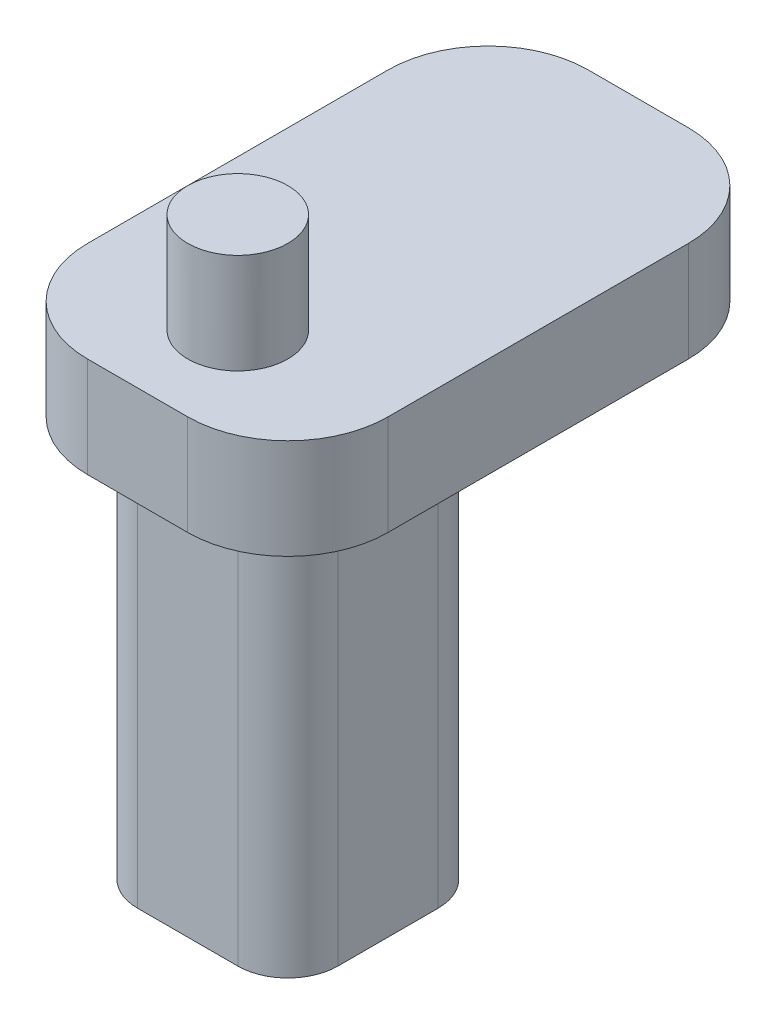
ISO-10303-21;
HEADER;
FILE_DESCRIPTION(('STEP AP214'),'2;1');
FILE_NAME('part.step','',(''),(''),'','','');
FILE_SCHEMA(('AUTOMOTIVE_DESIGN { 1 0 10303 214 1 1 1 1 }'));
ENDSEC;
DATA;
#1=APPLICATION_CONTEXT('core data for automotive mechanical design processes');
#2=APPLICATION_PROTOCOL_DEFINITION('international standard','automotive_design',2000,#1);
#3=PRODUCT_CONTEXT('',#1,'mechanical');
#4=PRODUCT('Part','Part','',(#3));
#5=PRODUCT_RELATED_PRODUCT_CATEGORY('part','',(#4));
#6=PRODUCT_DEFINITION_FORMATION('','',#4);
#7=PRODUCT_DEFINITION_CONTEXT('part definition',#1,'design');
#8=PRODUCT_DEFINITION('design','',#6,#7);
#9=PRODUCT_DEFINITION_SHAPE('','',#8);
#10=(LENGTH_UNIT() NAMED_UNIT(*) SI_UNIT(.MILLI.,.METRE.));
#11=(NAMED_UNIT(*) PLANE_ANGLE_UNIT() SI_UNIT($,.RADIAN.));
#12=(NAMED_UNIT(*) SI_UNIT($,.STERADIAN.) SOLID_ANGLE_UNIT());
#13=UNCERTAINTY_MEASURE_WITH_UNIT(LENGTH_MEASURE(1.E-05),#10,'distance_accuracy_value','');
#14=(GEOMETRIC_REPRESENTATION_CONTEXT(3) GLOBAL_UNCERTAINTY_ASSIGNED_CONTEXT((#13)) GLOBAL_UNIT_ASSIGNED_CONTEXT((#10,
#11,#12)) REPRESENTATION_CONTEXT('',''));
#15=CARTESIAN_POINT('',(0.,0.,0.));
#16=DIRECTION('',(0.,0.,1.));
#17=DIRECTION('',(1.,0.,0.));
#18=AXIS2_PLACEMENT_3D('',#15,#16,#17);
#19=CARTESIAN_POINT('',(0.,0.,0.));
#20=DIRECTION('',(0.,-1.,0.));
#21=DIRECTION('',(0.,0.,-1.));
#22=AXIS2_PLACEMENT_3D('',#19,#20,#21);
#23=PLANE('',#22);
#24=DIRECTION('',(1.,0.,0.));
#25=VECTOR('',#24,1.);
#26=CARTESIAN_POINT('',(-15.,0.,25.));
#27=LINE('',#26,#25);
#28=CARTESIAN_POINT('',(-4.99999999999999,0.,25.));
#29=VERTEX_POINT('',#28);
#30=CARTESIAN_POINT('',(5.,0.,25.));
#31=VERTEX_POINT('',#30);
#32=EDGE_CURVE('E189',#29,#31,#27,.T.);
#33=ORIENTED_EDGE('',*,*,#32,.F.);
#34=CARTESIAN_POINT('',(-4.99999999999999,0.,15.));
#35=DIRECTION('',(0.,-1.,0.));
#36=DIRECTION('',(0.,0.,-1.));
#37=AXIS2_PLACEMENT_3D('',#34,#35,#36);
#38=CIRCLE('',#37,10.);
#39=CARTESIAN_POINT('',(-15.,0.,15.));
#40=VERTEX_POINT('',#39);
#41=EDGE_CURVE('E236',#29,#40,#38,.T.);
#42=ORIENTED_EDGE('',*,*,#41,.T.);
#43=DIRECTION('',(0.,0.,1.));
#44=VECTOR('',#43,1.);
#45=CARTESIAN_POINT('',(-15.,0.,25.));
#46=LINE('',#45,#44);
#47=CARTESIAN_POINT('',(-15.,0.,-15.));
#48=VERTEX_POINT('',#47);
#49=EDGE_CURVE('E202',#48,#40,#46,.T.);
#50=ORIENTED_EDGE('',*,*,#49,.F.);
#51=CARTESIAN_POINT('',(-4.99999999999999,0.,-15.));
#52=DIRECTION('',(0.,-1.,0.));
#53=DIRECTION('',(0.,0.,-1.));
#54=AXIS2_PLACEMENT_3D('',#51,#52,#53);
#55=CIRCLE('',#54,10.);
#56=CARTESIAN_POINT('',(-4.99999999999999,0.,-25.));
#57=VERTEX_POINT('',#56);
#58=EDGE_CURVE('E215',#48,#57,#55,.T.);
#59=ORIENTED_EDGE('',*,*,#58,.T.);
#60=DIRECTION('',(-1.,0.,0.));
#61=VECTOR('',#60,1.);
#62=CARTESIAN_POINT('',(-15.,0.,-25.));
#63=LINE('',#62,#61);
#64=CARTESIAN_POINT('',(5.,0.,-25.));
#65=VERTEX_POINT('',#64);
#66=EDGE_CURVE('E199',#65,#57,#63,.T.);
#67=ORIENTED_EDGE('',*,*,#66,.F.);
#68=CARTESIAN_POINT('',(5.,0.,-15.));
#69=DIRECTION('',(0.,-1.,0.));
#70=DIRECTION('',(0.,0.,-1.));
#71=AXIS2_PLACEMENT_3D('',#68,#69,#70);
#72=CIRCLE('',#71,10.);
#73=CARTESIAN_POINT('',(15.,0.,-15.));
#74=VERTEX_POINT('',#73);
#75=EDGE_CURVE('E212',#65,#74,#72,.T.);
#76=ORIENTED_EDGE('',*,*,#75,.T.);
#77=DIRECTION('',(0.,0.,-1.));
#78=VECTOR('',#77,1.);
#79=CARTESIAN_POINT('',(15.,0.,25.));
#80=LINE('',#79,#78);
#81=CARTESIAN_POINT('',(15.,0.,15.));
#82=VERTEX_POINT('',#81);
#83=EDGE_CURVE('E180',#82,#74,#80,.T.);
#84=ORIENTED_EDGE('',*,*,#83,.F.);
#85=CARTESIAN_POINT('',(5.,0.,15.));
#86=DIRECTION('',(0.,-1.,0.));
#87=DIRECTION('',(0.,0.,-1.));
#88=AXIS2_PLACEMENT_3D('',#85,#86,#87);
#89=CIRCLE('',#88,10.);
#90=EDGE_CURVE('E234',#82,#31,#89,.T.);
#91=ORIENTED_EDGE('',*,*,#90,.T.);
#92=EDGE_LOOP('',(#33,#42,#50,#59,#67,#76,#84,#91));
#93=FACE_BOUND('',#92,.T.);
#94=DIRECTION('',(-1.,0.,0.));
#95=VECTOR('',#94,1.);
#96=CARTESIAN_POINT('',(-4.99999999999999,0.,20.));
#97=LINE('',#96,#95);
#98=CARTESIAN_POINT('',(5.,0.,20.));
#99=VERTEX_POINT('',#98);
#100=CARTESIAN_POINT('',(-4.99999999999999,0.,20.));
#101=VERTEX_POINT('',#100);
#102=EDGE_CURVE('E468',#99,#101,#97,.T.);
#103=ORIENTED_EDGE('',*,*,#102,.F.);
#104=CARTESIAN_POINT('',(5.,0.,15.));
#105=DIRECTION('',(0.,-1.,0.));
#106=DIRECTION('',(0.,0.,-1.));
#107=AXIS2_PLACEMENT_3D('',#104,#105,#106);
#108=CIRCLE('',#107,5.);
#109=CARTESIAN_POINT('',(10.,0.,15.));
#110=VERTEX_POINT('',#109);
#111=EDGE_CURVE('E175',#110,#99,#108,.T.);
#112=ORIENTED_EDGE('',*,*,#111,.F.);
#113=DIRECTION('',(0.,0.,1.));
#114=VECTOR('',#113,1.);
#115=CARTESIAN_POINT('',(10.,0.,15.));
#116=LINE('',#115,#114);
#117=CARTESIAN_POINT('',(10.,0.,5.00000000000007));
#118=VERTEX_POINT('',#117);
#119=EDGE_CURVE('E171',#118,#110,#116,.T.);
#120=ORIENTED_EDGE('',*,*,#119,.F.);
#121=CARTESIAN_POINT('',(5.,0.,5.));
#122=DIRECTION('',(0.,-1.,0.));
#123=DIRECTION('',(0.,0.,-1.));
#124=AXIS2_PLACEMENT_3D('',#121,#122,#123);
#125=CIRCLE('',#124,5.);
#126=CARTESIAN_POINT('',(4.99999999999997,0.,0.));
#127=VERTEX_POINT('',#126);
#128=EDGE_CURVE('E464',#127,#118,#125,.T.);
#129=ORIENTED_EDGE('',*,*,#128,.F.);
#130=DIRECTION('',(1.,0.,0.));
#131=VECTOR('',#130,1.);
#132=CARTESIAN_POINT('',(4.99999999999997,0.,0.));
#133=LINE('',#132,#131);
#134=CARTESIAN_POINT('',(-4.99999999999992,0.,0.));
#135=VERTEX_POINT('',#134);
#136=EDGE_CURVE('E480',#135,#127,#133,.T.);
#137=ORIENTED_EDGE('',*,*,#136,.F.);
#138=CARTESIAN_POINT('',(-4.99999999999999,0.,5.));
#139=DIRECTION('',(0.,-1.,0.));
#140=DIRECTION('',(0.,0.,-1.));
#141=AXIS2_PLACEMENT_3D('',#138,#139,#140);
#142=CIRCLE('',#141,5.);
#143=CARTESIAN_POINT('',(-9.99999999999999,0.,5.00000000000004));
#144=VERTEX_POINT('',#143);
#145=EDGE_CURVE('E478',#144,#135,#142,.T.);
#146=ORIENTED_EDGE('',*,*,#145,.F.);
#147=DIRECTION('',(0.,0.,-1.));
#148=VECTOR('',#147,1.);
#149=CARTESIAN_POINT('',(-9.99999999999999,0.,5.00000000000003));
#150=LINE('',#149,#148);
#151=CARTESIAN_POINT('',(-9.99999999999999,0.,15.));
#152=VERTEX_POINT('',#151);
#153=EDGE_CURVE('E476',#152,#144,#150,.T.);
#154=ORIENTED_EDGE('',*,*,#153,.F.);
#155=CARTESIAN_POINT('',(-4.99999999999999,0.,15.));
#156=DIRECTION('',(0.,-1.,0.));
#157=DIRECTION('',(0.,0.,-1.));
#158=AXIS2_PLACEMENT_3D('',#155,#156,#157);
#159=CIRCLE('',#158,5.);
#160=EDGE_CURVE('E470',#101,#152,#159,.T.);
#161=ORIENTED_EDGE('',*,*,#160,.F.);
#162=EDGE_LOOP('',(#103,#112,#120,#129,#137,#146,#154,#161));
#163=FACE_BOUND('',#162,.T.);
#164=ADVANCED_FACE('F38',(#93,#163),#23,.T.);
#165=CARTESIAN_POINT('',(15.,10.,25.));
#166=DIRECTION('',(-1.,0.,0.));
#167=DIRECTION('',(0.,0.,1.));
#168=AXIS2_PLACEMENT_3D('',#165,#166,#167);
#169=PLANE('',#168);
#170=DIRECTION('',(0.,0.,-1.));
#171=VECTOR('',#170,1.);
#172=CARTESIAN_POINT('',(15.,10.,25.));
#173=LINE('',#172,#171);
#174=CARTESIAN_POINT('',(15.,10.,15.));
#175=VERTEX_POINT('',#174);
#176=CARTESIAN_POINT('',(15.,10.,-15.));
#177=VERTEX_POINT('',#176);
#178=EDGE_CURVE('E186',#175,#177,#173,.T.);
#179=ORIENTED_EDGE('',*,*,#178,.F.);
#180=DIRECTION('',(0.,-1.,0.));
#181=VECTOR('',#180,1.);
#182=CARTESIAN_POINT('',(15.,10.,15.));
#183=LINE('',#182,#181);
#184=EDGE_CURVE('E11',#175,#82,#183,.T.);
#185=ORIENTED_EDGE('',*,*,#184,.T.);
#186=ORIENTED_EDGE('',*,*,#83,.T.);
#187=DIRECTION('',(0.,-1.,0.));
#188=VECTOR('',#187,1.);
#189=CARTESIAN_POINT('',(15.,10.,-15.));
#190=LINE('',#189,#188);
#191=EDGE_CURVE('E226',#74,#177,#190,.F.);
#192=ORIENTED_EDGE('',*,*,#191,.T.);
#193=EDGE_LOOP('',(#179,#185,#186,#192));
#194=FACE_BOUND('',#193,.T.);
#195=ADVANCED_FACE('F273',(#194),#169,.F.);
#196=CARTESIAN_POINT('',(-15.,10.,-25.));
#197=DIRECTION('',(0.,0.,1.));
#198=DIRECTION('',(1.,0.,0.));
#199=AXIS2_PLACEMENT_3D('',#196,#197,#198);
#200=PLANE('',#199);
#201=ORIENTED_EDGE('',*,*,#66,.T.);
#202=DIRECTION('',(0.,-1.,0.));
#203=VECTOR('',#202,1.);
#204=CARTESIAN_POINT('',(-4.99999999999999,10.,-25.));
#205=LINE('',#204,#203);
#206=CARTESIAN_POINT('',(-4.99999999999999,10.,-25.));
#207=VERTEX_POINT('',#206);
#208=EDGE_CURVE('E220',#57,#207,#205,.F.);
#209=ORIENTED_EDGE('',*,*,#208,.T.);
#210=DIRECTION('',(-1.,0.,0.));
#211=VECTOR('',#210,1.);
#212=CARTESIAN_POINT('',(-15.,10.,-25.));
#213=LINE('',#212,#211);
#214=CARTESIAN_POINT('',(5.,10.,-25.));
#215=VERTEX_POINT('',#214);
#216=EDGE_CURVE('E188',#215,#207,#213,.T.);
#217=ORIENTED_EDGE('',*,*,#216,.F.);
#218=DIRECTION('',(0.,-1.,0.));
#219=VECTOR('',#218,1.);
#220=CARTESIAN_POINT('',(5.,10.,-25.));
#221=LINE('',#220,#219);
#222=EDGE_CURVE('E217',#215,#65,#221,.T.);
#223=ORIENTED_EDGE('',*,*,#222,.T.);
#224=EDGE_LOOP('',(#201,#209,#217,#223));
#225=FACE_BOUND('',#224,.T.);
#226=ADVANCED_FACE('F264',(#225),#200,.F.);
#227=CARTESIAN_POINT('',(-15.,10.,25.));
#228=DIRECTION('',(1.,0.,0.));
#229=DIRECTION('',(0.,0.,-1.));
#230=AXIS2_PLACEMENT_3D('',#227,#228,#229);
#231=PLANE('',#230);
#232=ORIENTED_EDGE('',*,*,#49,.T.);
#233=DIRECTION('',(0.,-1.,0.));
#234=VECTOR('',#233,1.);
#235=CARTESIAN_POINT('',(-15.,10.,15.));
#236=LINE('',#235,#234);
#237=CARTESIAN_POINT('',(-15.,10.,15.));
#238=VERTEX_POINT('',#237);
#239=EDGE_CURVE('E238',#40,#238,#236,.F.);
#240=ORIENTED_EDGE('',*,*,#239,.T.);
#241=DIRECTION('',(0.,0.,1.));
#242=VECTOR('',#241,1.);
#243=CARTESIAN_POINT('',(-15.,10.,25.));
#244=LINE('',#243,#242);
#245=CARTESIAN_POINT('',(-15.,10.,-15.));
#246=VERTEX_POINT('',#245);
#247=EDGE_CURVE('E192',#246,#238,#244,.T.);
#248=ORIENTED_EDGE('',*,*,#247,.F.);
#249=DIRECTION('',(0.,-1.,0.));
#250=VECTOR('',#249,1.);
#251=CARTESIAN_POINT('',(-15.,10.,-15.));
#252=LINE('',#251,#250);
#253=EDGE_CURVE('E209',#246,#48,#252,.T.);
#254=ORIENTED_EDGE('',*,*,#253,.T.);
#255=EDGE_LOOP('',(#232,#240,#248,#254));
#256=FACE_BOUND('',#255,.T.);
#257=ADVANCED_FACE('F256',(#256),#231,.F.);
#258=CARTESIAN_POINT('',(-15.,10.,25.));
#259=DIRECTION('',(0.,0.,-1.));
#260=DIRECTION('',(-1.,0.,0.));
#261=AXIS2_PLACEMENT_3D('',#258,#259,#260);
#262=PLANE('',#261);
#263=DIRECTION('',(1.,0.,0.));
#264=VECTOR('',#263,1.);
#265=CARTESIAN_POINT('',(-15.,10.,25.));
#266=LINE('',#265,#264);
#267=CARTESIAN_POINT('',(-4.99999999999999,10.,25.));
#268=VERTEX_POINT('',#267);
#269=CARTESIAN_POINT('',(5.,10.,25.));
#270=VERTEX_POINT('',#269);
#271=EDGE_CURVE('E195',#268,#270,#266,.T.);
#272=ORIENTED_EDGE('',*,*,#271,.F.);
#273=DIRECTION('',(0.,-1.,0.));
#274=VECTOR('',#273,1.);
#275=CARTESIAN_POINT('',(-4.99999999999999,10.,25.));
#276=LINE('',#275,#274);
#277=EDGE_CURVE('E231',#268,#29,#276,.T.);
#278=ORIENTED_EDGE('',*,*,#277,.T.);
#279=ORIENTED_EDGE('',*,*,#32,.T.);
#280=DIRECTION('',(0.,-1.,0.));
#281=VECTOR('',#280,1.);
#282=CARTESIAN_POINT('',(5.,10.,25.));
#283=LINE('',#282,#281);
#284=EDGE_CURVE('E229',#31,#270,#283,.F.);
#285=ORIENTED_EDGE('',*,*,#284,.T.);
#286=EDGE_LOOP('',(#272,#278,#279,#285));
#287=FACE_BOUND('',#286,.T.);
#288=ADVANCED_FACE('F248',(#287),#262,.F.);
#289=CARTESIAN_POINT('',(0.,10.,0.));
#290=DIRECTION('',(0.,-1.,0.));
#291=DIRECTION('',(0.,0.,-1.));
#292=AXIS2_PLACEMENT_3D('',#289,#290,#291);
#293=PLANE('',#292);
#294=CARTESIAN_POINT('',(0.,10.,15.));
#295=DIRECTION('',(0.,-1.,0.));
#296=DIRECTION('',(0.,0.,-1.));
#297=AXIS2_PLACEMENT_3D('',#294,#295,#296);
#298=CIRCLE('',#297,5.);
#299=CARTESIAN_POINT('',(0.,10.,9.99999999999999));
#300=VERTEX_POINT('',#299);
#301=EDGE_CURVE('E197',#300,#300,#298,.F.);
#302=ORIENTED_EDGE('',*,*,#301,.F.);
#303=EDGE_LOOP('',(#302));
#304=FACE_BOUND('',#303,.T.);
#305=ORIENTED_EDGE('',*,*,#247,.T.);
#306=CARTESIAN_POINT('',(-4.99999999999999,10.,15.));
#307=DIRECTION('',(0.,-1.,0.));
#308=DIRECTION('',(0.,0.,-1.));
#309=AXIS2_PLACEMENT_3D('',#306,#307,#308);
#310=CIRCLE('',#309,10.);
#311=EDGE_CURVE('E46',#238,#268,#310,.F.);
#312=ORIENTED_EDGE('',*,*,#311,.T.);
#313=ORIENTED_EDGE('',*,*,#271,.T.);
#314=CARTESIAN_POINT('',(5.,10.,15.));
#315=DIRECTION('',(0.,-1.,0.));
#316=DIRECTION('',(0.,0.,-1.));
#317=AXIS2_PLACEMENT_3D('',#314,#315,#316);
#318=CIRCLE('',#317,10.);
#319=EDGE_CURVE('E61',#270,#175,#318,.F.);
#320=ORIENTED_EDGE('',*,*,#319,.T.);
#321=ORIENTED_EDGE('',*,*,#178,.T.);
#322=CARTESIAN_POINT('',(5.,10.,-15.));
#323=DIRECTION('',(0.,-1.,0.));
#324=DIRECTION('',(0.,0.,-1.));
#325=AXIS2_PLACEMENT_3D('',#322,#323,#324);
#326=CIRCLE('',#325,10.);
#327=EDGE_CURVE('E222',#177,#215,#326,.F.);
#328=ORIENTED_EDGE('',*,*,#327,.T.);
#329=ORIENTED_EDGE('',*,*,#216,.T.);
#330=CARTESIAN_POINT('',(-4.99999999999999,10.,-15.));
#331=DIRECTION('',(0.,-1.,0.));
#332=DIRECTION('',(0.,0.,-1.));
#333=AXIS2_PLACEMENT_3D('',#330,#331,#332);
#334=CIRCLE('',#333,10.);
#335=EDGE_CURVE('E224',#207,#246,#334,.F.);
#336=ORIENTED_EDGE('',*,*,#335,.T.);
#337=EDGE_LOOP('',(#305,#312,#313,#320,#321,#328,#329,#336));
#338=FACE_BOUND('',#337,.T.);
#339=ADVANCED_FACE('F242',(#304,#338),#293,.F.);
#340=CARTESIAN_POINT('',(0.,20.,15.));
#341=DIRECTION('',(0.,-1.,0.));
#342=DIRECTION('',(0.,0.,-1.));
#343=AXIS2_PLACEMENT_3D('',#340,#341,#342);
#344=CYLINDRICAL_SURFACE('',#343,5.);
#345=CARTESIAN_POINT('',(0.,20.,15.));
#346=DIRECTION('',(0.,1.,0.));
#347=DIRECTION('',(0.,0.,1.));
#348=AXIS2_PLACEMENT_3D('',#345,#346,#347);
#349=CIRCLE('',#348,5.);
#350=CARTESIAN_POINT('',(0.,20.,20.));
#351=VERTEX_POINT('',#350);
#352=EDGE_CURVE('E177',#351,#351,#349,.T.);
#353=ORIENTED_EDGE('',*,*,#352,.F.);
#354=EDGE_LOOP('',(#353));
#355=FACE_BOUND('',#354,.T.);
#356=ORIENTED_EDGE('',*,*,#301,.T.);
#357=EDGE_LOOP('',(#356));
#358=FACE_BOUND('',#357,.T.);
#359=ADVANCED_FACE('F410',(#355,#358),#344,.T.);
#360=CARTESIAN_POINT('',(0.,20.,15.));
#361=DIRECTION('',(0.,1.,0.));
#362=DIRECTION('',(0.,0.,1.));
#363=AXIS2_PLACEMENT_3D('',#360,#361,#362);
#364=PLANE('',#363);
#365=ORIENTED_EDGE('',*,*,#352,.T.);
#366=EDGE_LOOP('',(#365));
#367=FACE_BOUND('',#366,.T.);
#368=ADVANCED_FACE('F299',(#367),#364,.T.);
#369=CARTESIAN_POINT('',(-4.99999999999999,10.,-15.));
#370=DIRECTION('',(0.,-1.,0.));
#371=DIRECTION('',(0.,0.,-1.));
#372=AXIS2_PLACEMENT_3D('',#369,#370,#371);
#373=CYLINDRICAL_SURFACE('',#372,10.);
#374=ORIENTED_EDGE('',*,*,#335,.F.);
#375=ORIENTED_EDGE('',*,*,#208,.F.);
#376=ORIENTED_EDGE('',*,*,#58,.F.);
#377=ORIENTED_EDGE('',*,*,#253,.F.);
#378=EDGE_LOOP('',(#374,#375,#376,#377));
#379=FACE_BOUND('',#378,.T.);
#380=ADVANCED_FACE('F260',(#379),#373,.T.);
#381=CARTESIAN_POINT('',(5.,10.,-15.));
#382=DIRECTION('',(0.,-1.,0.));
#383=DIRECTION('',(0.,0.,-1.));
#384=AXIS2_PLACEMENT_3D('',#381,#382,#383);
#385=CYLINDRICAL_SURFACE('',#384,10.);
#386=ORIENTED_EDGE('',*,*,#327,.F.);
#387=ORIENTED_EDGE('',*,*,#191,.F.);
#388=ORIENTED_EDGE('',*,*,#75,.F.);
#389=ORIENTED_EDGE('',*,*,#222,.F.);
#390=EDGE_LOOP('',(#386,#387,#388,#389));
#391=FACE_BOUND('',#390,.T.);
#392=ADVANCED_FACE('F269',(#391),#385,.T.);
#393=CARTESIAN_POINT('',(-4.99999999999999,10.,15.));
#394=DIRECTION('',(0.,-1.,0.));
#395=DIRECTION('',(0.,0.,-1.));
#396=AXIS2_PLACEMENT_3D('',#393,#394,#395);
#397=CYLINDRICAL_SURFACE('',#396,10.);
#398=ORIENTED_EDGE('',*,*,#311,.F.);
#399=ORIENTED_EDGE('',*,*,#239,.F.);
#400=ORIENTED_EDGE('',*,*,#41,.F.);
#401=ORIENTED_EDGE('',*,*,#277,.F.);
#402=EDGE_LOOP('',(#398,#399,#400,#401));
#403=FACE_BOUND('',#402,.T.);
#404=ADVANCED_FACE('F251',(#403),#397,.T.);
#405=CARTESIAN_POINT('',(5.,10.,15.));
#406=DIRECTION('',(0.,-1.,0.));
#407=DIRECTION('',(0.,0.,-1.));
#408=AXIS2_PLACEMENT_3D('',#405,#406,#407);
#409=CYLINDRICAL_SURFACE('',#408,10.);
#410=ORIENTED_EDGE('',*,*,#319,.F.);
#411=ORIENTED_EDGE('',*,*,#284,.F.);
#412=ORIENTED_EDGE('',*,*,#90,.F.);
#413=ORIENTED_EDGE('',*,*,#184,.F.);
#414=EDGE_LOOP('',(#410,#411,#412,#413));
#415=FACE_BOUND('',#414,.T.);
#416=ADVANCED_FACE('F40',(#415),#409,.T.);
#417=CARTESIAN_POINT('',(5.,-40.,15.));
#418=DIRECTION('',(0.,1.,0.));
#419=DIRECTION('',(0.,0.,1.));
#420=AXIS2_PLACEMENT_3D('',#417,#418,#419);
#421=CYLINDRICAL_SURFACE('',#420,5.);
#422=ORIENTED_EDGE('',*,*,#111,.T.);
#423=DIRECTION('',(0.,1.,0.));
#424=VECTOR('',#423,1.);
#425=CARTESIAN_POINT('',(5.,-40.,20.));
#426=LINE('',#425,#424);
#427=CARTESIAN_POINT('',(5.,-40.,20.));
#428=VERTEX_POINT('',#427);
#429=EDGE_CURVE('E156',#428,#99,#426,.T.);
#430=ORIENTED_EDGE('',*,*,#429,.F.);
#431=CARTESIAN_POINT('',(5.,-40.,15.));
#432=DIRECTION('',(0.,-1.,0.));
#433=DIRECTION('',(0.,0.,-1.));
#434=AXIS2_PLACEMENT_3D('',#431,#432,#433);
#435=CIRCLE('',#434,5.);
#436=CARTESIAN_POINT('',(10.,-40.,15.));
#437=VERTEX_POINT('',#436);
#438=EDGE_CURVE('E163',#437,#428,#435,.T.);
#439=ORIENTED_EDGE('',*,*,#438,.F.);
#440=DIRECTION('',(0.,1.,0.));
#441=VECTOR('',#440,1.);
#442=CARTESIAN_POINT('',(10.,-40.,15.));
#443=LINE('',#442,#441);
#444=EDGE_CURVE('E462',#437,#110,#443,.T.);
#445=ORIENTED_EDGE('',*,*,#444,.T.);
#446=EDGE_LOOP('',(#422,#430,#439,#445));
#447=FACE_BOUND('',#446,.T.);
#448=ADVANCED_FACE('F173',(#447),#421,.T.);
#449=CARTESIAN_POINT('',(-4.99999999999999,-40.,20.));
#450=DIRECTION('',(0.,0.,-1.));
#451=DIRECTION('',(-1.,0.,0.));
#452=AXIS2_PLACEMENT_3D('',#449,#450,#451);
#453=PLANE('',#452);
#454=ORIENTED_EDGE('',*,*,#102,.T.);
#455=DIRECTION('',(0.,1.,0.));
#456=VECTOR('',#455,1.);
#457=CARTESIAN_POINT('',(-4.99999999999999,-40.,20.));
#458=LINE('',#457,#456);
#459=CARTESIAN_POINT('',(-4.99999999999999,-40.,20.));
#460=VERTEX_POINT('',#459);
#461=EDGE_CURVE('E159',#460,#101,#458,.T.);
#462=ORIENTED_EDGE('',*,*,#461,.F.);
#463=DIRECTION('',(-1.,0.,0.));
#464=VECTOR('',#463,1.);
#465=CARTESIAN_POINT('',(-4.99999999999999,-40.,20.));
#466=LINE('',#465,#464);
#467=EDGE_CURVE('E152',#428,#460,#466,.T.);
#468=ORIENTED_EDGE('',*,*,#467,.F.);
#469=ORIENTED_EDGE('',*,*,#429,.T.);
#470=EDGE_LOOP('',(#454,#462,#468,#469));
#471=FACE_BOUND('',#470,.T.);
#472=ADVANCED_FACE('F154',(#471),#453,.F.);
#473=CARTESIAN_POINT('',(-4.99999999999999,-40.,15.));
#474=DIRECTION('',(0.,1.,0.));
#475=DIRECTION('',(0.,0.,1.));
#476=AXIS2_PLACEMENT_3D('',#473,#474,#475);
#477=CYLINDRICAL_SURFACE('',#476,5.);
#478=ORIENTED_EDGE('',*,*,#160,.T.);
#479=DIRECTION('',(0.,1.,0.));
#480=VECTOR('',#479,1.);
#481=CARTESIAN_POINT('',(-9.99999999999999,-40.,15.));
#482=LINE('',#481,#480);
#483=CARTESIAN_POINT('',(-9.99999999999999,-40.,15.));
#484=VERTEX_POINT('',#483);
#485=EDGE_CURVE('E182',#484,#152,#482,.T.);
#486=ORIENTED_EDGE('',*,*,#485,.F.);
#487=CARTESIAN_POINT('',(-4.99999999999999,-40.,15.));
#488=DIRECTION('',(0.,-1.,0.));
#489=DIRECTION('',(0.,0.,-1.));
#490=AXIS2_PLACEMENT_3D('',#487,#488,#489);
#491=CIRCLE('',#490,5.);
#492=EDGE_CURVE('E162',#460,#484,#491,.T.);
#493=ORIENTED_EDGE('',*,*,#492,.F.);
#494=ORIENTED_EDGE('',*,*,#461,.T.);
#495=EDGE_LOOP('',(#478,#486,#493,#494));
#496=FACE_BOUND('',#495,.T.);
#497=ADVANCED_FACE('F339',(#496),#477,.T.);
#498=CARTESIAN_POINT('',(-9.99999999999999,-40.,5.00000000000003));
#499=DIRECTION('',(1.,0.,0.));
#500=DIRECTION('',(0.,0.,-1.));
#501=AXIS2_PLACEMENT_3D('',#498,#499,#500);
#502=PLANE('',#501);
#503=ORIENTED_EDGE('',*,*,#153,.T.);
#504=DIRECTION('',(0.,1.,0.));
#505=VECTOR('',#504,1.);
#506=CARTESIAN_POINT('',(-9.99999999999999,-40.,5.00000000000004));
#507=LINE('',#506,#505);
#508=CARTESIAN_POINT('',(-9.99999999999999,-40.,5.00000000000004));
#509=VERTEX_POINT('',#508);
#510=EDGE_CURVE('E490',#509,#144,#507,.T.);
#511=ORIENTED_EDGE('',*,*,#510,.F.);
#512=DIRECTION('',(0.,0.,-1.));
#513=VECTOR('',#512,1.);
#514=CARTESIAN_POINT('',(-9.99999999999999,-40.,5.00000000000003));
#515=LINE('',#514,#513);
#516=EDGE_CURVE('E497',#484,#509,#515,.T.);
#517=ORIENTED_EDGE('',*,*,#516,.F.);
#518=ORIENTED_EDGE('',*,*,#485,.T.);
#519=EDGE_LOOP('',(#503,#511,#517,#518));
#520=FACE_BOUND('',#519,.T.);
#521=ADVANCED_FACE('F348',(#520),#502,.F.);
#522=CARTESIAN_POINT('',(-4.99999999999999,-40.,5.));
#523=DIRECTION('',(0.,1.,0.));
#524=DIRECTION('',(0.,0.,1.));
#525=AXIS2_PLACEMENT_3D('',#522,#523,#524);
#526=CYLINDRICAL_SURFACE('',#525,5.);
#527=ORIENTED_EDGE('',*,*,#145,.T.);
#528=DIRECTION('',(0.,1.,0.));
#529=VECTOR('',#528,1.);
#530=CARTESIAN_POINT('',(-4.99999999999992,-40.,0.));
#531=LINE('',#530,#529);
#532=CARTESIAN_POINT('',(-4.99999999999992,-40.,0.));
#533=VERTEX_POINT('',#532);
#534=EDGE_CURVE('E487',#533,#135,#531,.T.);
#535=ORIENTED_EDGE('',*,*,#534,.F.);
#536=CARTESIAN_POINT('',(-4.99999999999999,-40.,5.));
#537=DIRECTION('',(0.,-1.,0.));
#538=DIRECTION('',(0.,0.,-1.));
#539=AXIS2_PLACEMENT_3D('',#536,#537,#538);
#540=CIRCLE('',#539,5.);
#541=EDGE_CURVE('E507',#509,#533,#540,.T.);
#542=ORIENTED_EDGE('',*,*,#541,.F.);
#543=ORIENTED_EDGE('',*,*,#510,.T.);
#544=EDGE_LOOP('',(#527,#535,#542,#543));
#545=FACE_BOUND('',#544,.T.);
#546=ADVANCED_FACE('F358',(#545),#526,.T.);
#547=CARTESIAN_POINT('',(4.99999999999997,-40.,0.));
#548=DIRECTION('',(0.,0.,1.));
#549=DIRECTION('',(1.,0.,0.));
#550=AXIS2_PLACEMENT_3D('',#547,#548,#549);
#551=PLANE('',#550);
#552=ORIENTED_EDGE('',*,*,#136,.T.);
#553=DIRECTION('',(0.,1.,0.));
#554=VECTOR('',#553,1.);
#555=CARTESIAN_POINT('',(4.99999999999997,-40.,0.));
#556=LINE('',#555,#554);
#557=CARTESIAN_POINT('',(4.99999999999997,-40.,0.));
#558=VERTEX_POINT('',#557);
#559=EDGE_CURVE('E484',#558,#127,#556,.T.);
#560=ORIENTED_EDGE('',*,*,#559,.F.);
#561=DIRECTION('',(1.,0.,0.));
#562=VECTOR('',#561,1.);
#563=CARTESIAN_POINT('',(4.99999999999997,-40.,0.));
#564=LINE('',#563,#562);
#565=EDGE_CURVE('E504',#533,#558,#564,.T.);
#566=ORIENTED_EDGE('',*,*,#565,.F.);
#567=ORIENTED_EDGE('',*,*,#534,.T.);
#568=EDGE_LOOP('',(#552,#560,#566,#567));
#569=FACE_BOUND('',#568,.T.);
#570=ADVANCED_FACE('F368',(#569),#551,.F.);
#571=CARTESIAN_POINT('',(5.,-40.,5.));
#572=DIRECTION('',(0.,1.,0.));
#573=DIRECTION('',(0.,0.,1.));
#574=AXIS2_PLACEMENT_3D('',#571,#572,#573);
#575=CYLINDRICAL_SURFACE('',#574,5.);
#576=ORIENTED_EDGE('',*,*,#128,.T.);
#577=DIRECTION('',(0.,1.,0.));
#578=VECTOR('',#577,1.);
#579=CARTESIAN_POINT('',(10.,-40.,5.00000000000007));
#580=LINE('',#579,#578);
#581=CARTESIAN_POINT('',(10.,-40.,5.00000000000007));
#582=VERTEX_POINT('',#581);
#583=EDGE_CURVE('E53',#582,#118,#580,.T.);
#584=ORIENTED_EDGE('',*,*,#583,.F.);
#585=CARTESIAN_POINT('',(5.,-40.,5.));
#586=DIRECTION('',(0.,-1.,0.));
#587=DIRECTION('',(0.,0.,-1.));
#588=AXIS2_PLACEMENT_3D('',#585,#586,#587);
#589=CIRCLE('',#588,5.);
#590=EDGE_CURVE('E506',#558,#582,#589,.T.);
#591=ORIENTED_EDGE('',*,*,#590,.F.);
#592=ORIENTED_EDGE('',*,*,#559,.T.);
#593=EDGE_LOOP('',(#576,#584,#591,#592));
#594=FACE_BOUND('',#593,.T.);
#595=ADVANCED_FACE('F378',(#594),#575,.T.);
#596=CARTESIAN_POINT('',(10.,-40.,15.));
#597=DIRECTION('',(-1.,0.,0.));
#598=DIRECTION('',(0.,0.,1.));
#599=AXIS2_PLACEMENT_3D('',#596,#597,#598);
#600=PLANE('',#599);
#601=ORIENTED_EDGE('',*,*,#119,.T.);
#602=ORIENTED_EDGE('',*,*,#444,.F.);
#603=DIRECTION('',(0.,0.,1.));
#604=VECTOR('',#603,1.);
#605=CARTESIAN_POINT('',(10.,-40.,15.));
#606=LINE('',#605,#604);
#607=EDGE_CURVE('E167',#582,#437,#606,.T.);
#608=ORIENTED_EDGE('',*,*,#607,.F.);
#609=ORIENTED_EDGE('',*,*,#583,.T.);
#610=EDGE_LOOP('',(#601,#602,#608,#609));
#611=FACE_BOUND('',#610,.T.);
#612=ADVANCED_FACE('F388',(#611),#600,.F.);
#613=CARTESIAN_POINT('',(5.,-40.,15.));
#614=DIRECTION('',(0.,-1.,0.));
#615=DIRECTION('',(0.,0.,-1.));
#616=AXIS2_PLACEMENT_3D('',#613,#614,#615);
#617=PLANE('',#616);
#618=ORIENTED_EDGE('',*,*,#438,.T.);
#619=ORIENTED_EDGE('',*,*,#467,.T.);
#620=ORIENTED_EDGE('',*,*,#492,.T.);
#621=ORIENTED_EDGE('',*,*,#516,.T.);
#622=ORIENTED_EDGE('',*,*,#541,.T.);
#623=ORIENTED_EDGE('',*,*,#565,.T.);
#624=ORIENTED_EDGE('',*,*,#590,.T.);
#625=ORIENTED_EDGE('',*,*,#607,.T.);
#626=EDGE_LOOP('',(#618,#619,#620,#621,#622,#623,#624,#625));
#627=FACE_BOUND('',#626,.T.);
#628=ADVANCED_FACE('F166',(#627),#617,.T.);
#629=CLOSED_SHELL('',(#164,#195,#226,#257,#288,#339,#359,#368,#380,#392,#404,#416,#448,#472,
#497,#521,#546,#570,#595,#612,#628));
#630=MANIFOLD_SOLID_BREP('B2',#629);
#631=ADVANCED_BREP_SHAPE_REPRESENTATION('',(#18,#630),#14);
#632=SHAPE_DEFINITION_REPRESENTATION(#9,#631);
ENDSEC;
END-ISO-10303-21;
